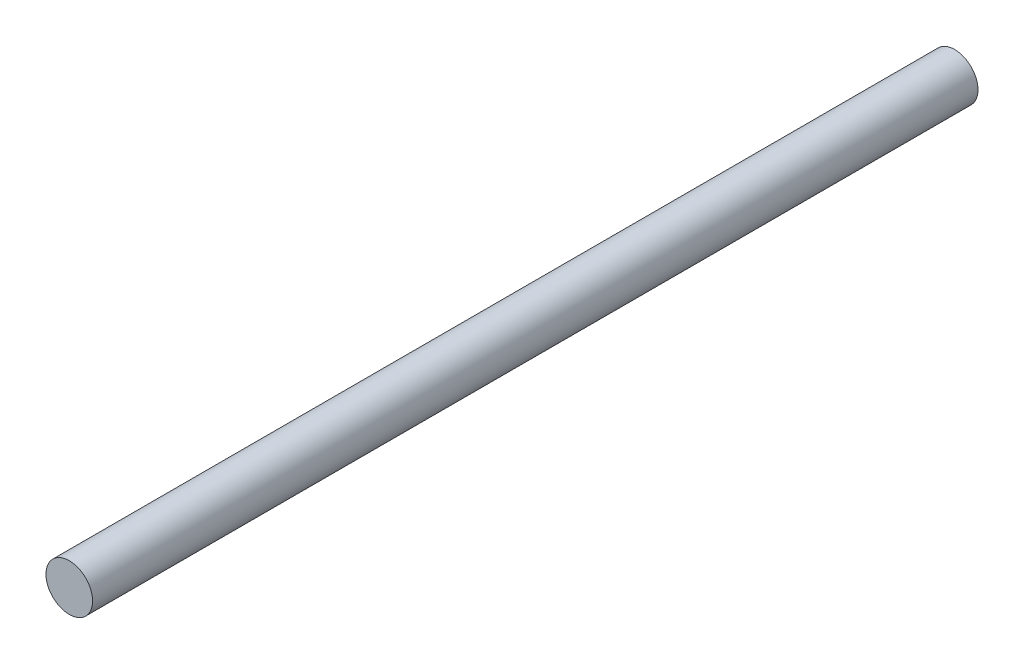
ISO-10303-21;
HEADER;
FILE_DESCRIPTION(('STEP AP214'),'2;1');
FILE_NAME('part.step','',(''),(''),'','','');
FILE_SCHEMA(('AUTOMOTIVE_DESIGN { 1 0 10303 214 1 1 1 1 }'));
ENDSEC;
DATA;
#1=APPLICATION_CONTEXT('core data for automotive mechanical design processes');
#2=APPLICATION_PROTOCOL_DEFINITION('international standard','automotive_design',2000,#1);
#3=PRODUCT_CONTEXT('',#1,'mechanical');
#4=PRODUCT('Part','Part','',(#3));
#5=PRODUCT_RELATED_PRODUCT_CATEGORY('part','',(#4));
#6=PRODUCT_DEFINITION_FORMATION('','',#4);
#7=PRODUCT_DEFINITION_CONTEXT('part definition',#1,'design');
#8=PRODUCT_DEFINITION('design','',#6,#7);
#9=PRODUCT_DEFINITION_SHAPE('','',#8);
#10=(LENGTH_UNIT() NAMED_UNIT(*) SI_UNIT(.MILLI.,.METRE.));
#11=(NAMED_UNIT(*) PLANE_ANGLE_UNIT() SI_UNIT($,.RADIAN.));
#12=(NAMED_UNIT(*) SI_UNIT($,.STERADIAN.) SOLID_ANGLE_UNIT());
#13=UNCERTAINTY_MEASURE_WITH_UNIT(LENGTH_MEASURE(1.E-05),#10,'distance_accuracy_value','');
#14=(GEOMETRIC_REPRESENTATION_CONTEXT(3) GLOBAL_UNCERTAINTY_ASSIGNED_CONTEXT((#13)) GLOBAL_UNIT_ASSIGNED_CONTEXT((#10,
#11,#12)) REPRESENTATION_CONTEXT('',''));
#15=CARTESIAN_POINT('',(0.,0.,0.));
#16=DIRECTION('',(0.,0.,1.));
#17=DIRECTION('',(1.,0.,0.));
#18=AXIS2_PLACEMENT_3D('',#15,#16,#17);
#19=CARTESIAN_POINT('',(0.,0.,190.));
#20=DIRECTION('',(0.,0.,1.));
#21=DIRECTION('',(1.,0.,0.));
#22=AXIS2_PLACEMENT_3D('',#19,#20,#21);
#23=PLANE('',#22);
#24=CARTESIAN_POINT('',(0.,0.,190.));
#25=DIRECTION('',(0.,0.,1.));
#26=DIRECTION('',(1.,0.,0.));
#27=AXIS2_PLACEMENT_3D('',#24,#25,#26);
#28=CIRCLE('',#27,5.);
#29=CARTESIAN_POINT('',(5.,0.,190.));
#30=VERTEX_POINT('',#29);
#31=EDGE_CURVE('P0_E18',#30,#30,#28,.F.);
#32=ORIENTED_EDGE('',*,*,#31,.F.);
#33=EDGE_LOOP('',(#32));
#34=FACE_BOUND('',#33,.T.);
#35=ADVANCED_FACE('P0_F15',(#34),#23,.T.);
#36=CARTESIAN_POINT('',(0.,0.,0.));
#37=DIRECTION('',(0.,0.,1.));
#38=DIRECTION('',(1.,0.,0.));
#39=AXIS2_PLACEMENT_3D('',#36,#37,#38);
#40=PLANE('',#39);
#41=CARTESIAN_POINT('',(0.,0.,0.));
#42=DIRECTION('',(0.,0.,1.));
#43=DIRECTION('',(1.,0.,0.));
#44=AXIS2_PLACEMENT_3D('',#41,#42,#43);
#45=CIRCLE('',#44,5.);
#46=CARTESIAN_POINT('',(5.,0.,0.));
#47=VERTEX_POINT('',#46);
#48=EDGE_CURVE('P0_E10',#47,#47,#45,.T.);
#49=ORIENTED_EDGE('',*,*,#48,.F.);
#50=EDGE_LOOP('',(#49));
#51=FACE_BOUND('',#50,.T.);
#52=ADVANCED_FACE('P0_F30',(#51),#40,.F.);
#53=CARTESIAN_POINT('',(0.,0.,0.));
#54=DIRECTION('',(0.,0.,1.));
#55=DIRECTION('',(1.,0.,0.));
#56=AXIS2_PLACEMENT_3D('',#53,#54,#55);
#57=CYLINDRICAL_SURFACE('',#56,5.);
#58=ORIENTED_EDGE('',*,*,#31,.T.);
#59=EDGE_LOOP('',(#58));
#60=FACE_BOUND('',#59,.T.);
#61=ORIENTED_EDGE('',*,*,#48,.T.);
#62=EDGE_LOOP('',(#61));
#63=FACE_BOUND('',#62,.T.);
#64=ADVANCED_FACE('P0_F27',(#60,#63),#57,.T.);
#65=CLOSED_SHELL('',(#35,#52,#64));
#66=MANIFOLD_SOLID_BREP('P0_B1',#65);
#67=CARTESIAN_POINT('',(0.,0.,190.));
#68=DIRECTION('',(0.,0.,-1.));
#69=DIRECTION('',(-1.,0.,0.));
#70=AXIS2_PLACEMENT_3D('',#67,#68,#69);
#71=CYLINDRICAL_SURFACE('',#70,4.5);
#72=CARTESIAN_POINT('',(0.,0.,0.));
#73=DIRECTION('',(0.,0.,-1.));
#74=DIRECTION('',(-1.,0.,0.));
#75=AXIS2_PLACEMENT_3D('',#72,#73,#74);
#76=CIRCLE('',#75,4.5);
#77=CARTESIAN_POINT('',(-4.5,0.,0.));
#78=VERTEX_POINT('',#77);
#79=EDGE_CURVE('P1_E16',#78,#78,#76,.F.);
#80=ORIENTED_EDGE('',*,*,#79,.T.);
#81=EDGE_LOOP('',(#80));
#82=FACE_BOUND('',#81,.T.);
#83=CARTESIAN_POINT('',(0.,0.,190.));
#84=DIRECTION('',(0.,0.,-1.));
#85=DIRECTION('',(-1.,0.,0.));
#86=AXIS2_PLACEMENT_3D('',#83,#84,#85);
#87=CIRCLE('',#86,4.5);
#88=CARTESIAN_POINT('',(-4.5,0.,190.));
#89=VERTEX_POINT('',#88);
#90=EDGE_CURVE('P1_E10',#89,#89,#87,.T.);
#91=ORIENTED_EDGE('',*,*,#90,.T.);
#92=EDGE_LOOP('',(#91));
#93=FACE_BOUND('',#92,.T.);
#94=ADVANCED_FACE('P1_F15',(#82,#93),#71,.T.);
#95=OPEN_SHELL('',(#94));
#96=SHELL_BASED_SURFACE_MODEL('P1_B1',(#95));
#97=ADVANCED_BREP_SHAPE_REPRESENTATION('',(#18,#66),#14);
#98=MANIFOLD_SURFACE_SHAPE_REPRESENTATION('',(#18,#96),#14);
#99=SHAPE_REPRESENTATION('',(#18),#14);
#100=SHAPE_DEFINITION_REPRESENTATION(#9,#99);
#101=SHAPE_REPRESENTATION_RELATIONSHIP('','',#99,#97);
#102=SHAPE_REPRESENTATION_RELATIONSHIP('','',#99,#98);
ENDSEC;
END-ISO-10303-21;
